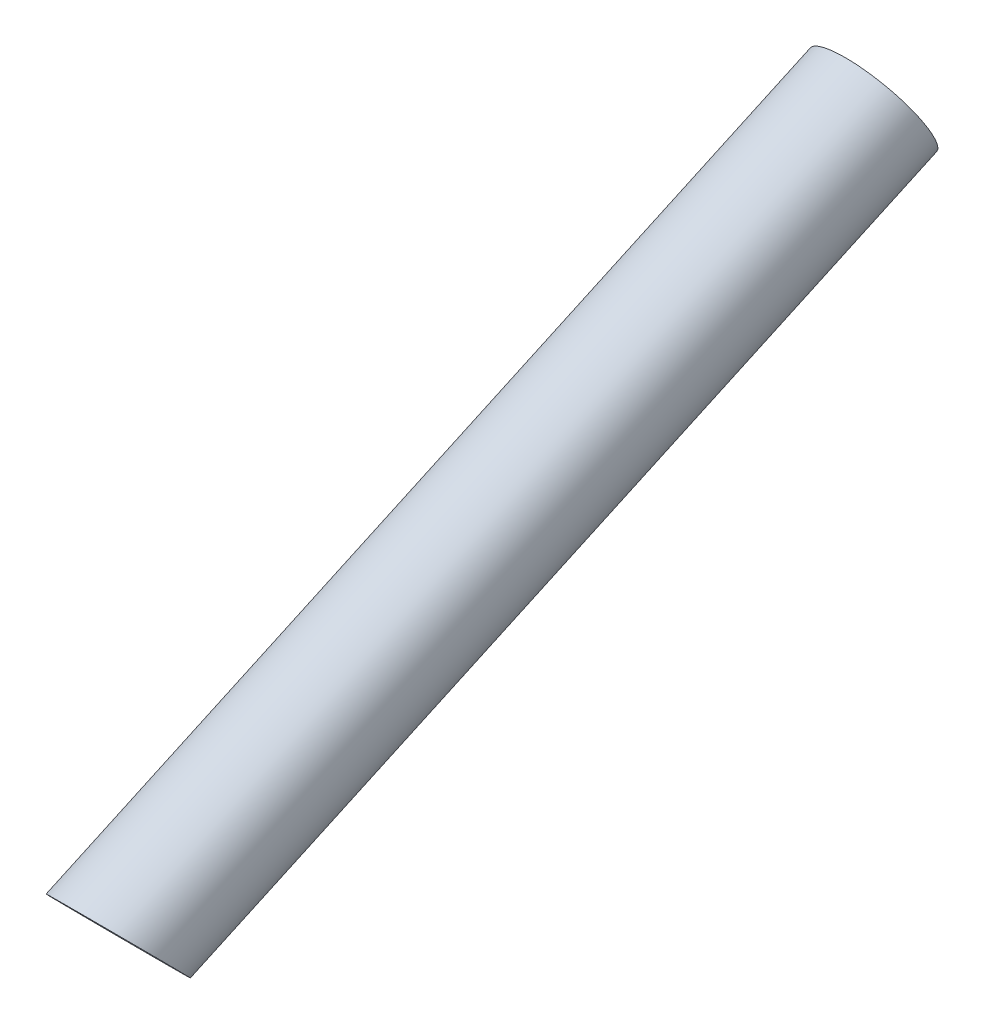
ISO-10303-21;
HEADER;
FILE_DESCRIPTION(('STEP AP214'),'2;1');
FILE_NAME('part.step','',(''),(''),'','','');
FILE_SCHEMA(('AUTOMOTIVE_DESIGN { 1 0 10303 214 1 1 1 1 }'));
ENDSEC;
DATA;
#1=APPLICATION_CONTEXT('core data for automotive mechanical design processes');
#2=APPLICATION_PROTOCOL_DEFINITION('international standard','automotive_design',2000,#1);
#3=PRODUCT_CONTEXT('',#1,'mechanical');
#4=PRODUCT('Part','Part','',(#3));
#5=PRODUCT_RELATED_PRODUCT_CATEGORY('part','',(#4));
#6=PRODUCT_DEFINITION_FORMATION('','',#4);
#7=PRODUCT_DEFINITION_CONTEXT('part definition',#1,'design');
#8=PRODUCT_DEFINITION('design','',#6,#7);
#9=PRODUCT_DEFINITION_SHAPE('','',#8);
#10=(LENGTH_UNIT() NAMED_UNIT(*) SI_UNIT(.MILLI.,.METRE.));
#11=(NAMED_UNIT(*) PLANE_ANGLE_UNIT() SI_UNIT($,.RADIAN.));
#12=(NAMED_UNIT(*) SI_UNIT($,.STERADIAN.) SOLID_ANGLE_UNIT());
#13=UNCERTAINTY_MEASURE_WITH_UNIT(LENGTH_MEASURE(1.E-05),#10,'distance_accuracy_value','');
#14=(GEOMETRIC_REPRESENTATION_CONTEXT(3) GLOBAL_UNCERTAINTY_ASSIGNED_CONTEXT((#13)) GLOBAL_UNIT_ASSIGNED_CONTEXT((#10,
#11,#12)) REPRESENTATION_CONTEXT('',''));
#15=CARTESIAN_POINT('',(0.,0.,0.));
#16=DIRECTION('',(0.,0.,1.));
#17=DIRECTION('',(1.,0.,0.));
#18=AXIS2_PLACEMENT_3D('',#15,#16,#17);
#19=CARTESIAN_POINT('',(0.,140.,1502.61697452191));
#20=DIRECTION('',(0.,0.417026346971061,-0.908894397568811));
#21=DIRECTION('',(0.,0.908894397568811,0.417026346971061));
#22=AXIS2_PLACEMENT_3D('',#19,#20,#21);
#23=CYLINDRICAL_SURFACE('',#22,9.);
#24=CARTESIAN_POINT('',(0.,140.,1502.61697452191));
#25=DIRECTION('',(0.,-0.702736773046392,0.711449947507443));
#26=DIRECTION('',(0.,-0.711449947507443,-0.702736773046392));
#27=AXIS2_PLACEMENT_3D('',#24,#25,#26);
#28=ELLIPSE('',#27,9.57759995228322,9.);
#29=CARTESIAN_POINT('',(0.,133.186017016701,1495.88644283791));
#30=VERTEX_POINT('',#29);
#31=EDGE_CURVE('E53',#30,#30,#28,.T.);
#32=ORIENTED_EDGE('',*,*,#31,.T.);
#33=EDGE_LOOP('',(#32));
#34=FACE_BOUND('',#33,.T.);
#35=CARTESIAN_POINT('',(0.,200.,1371.84906441211));
#36=DIRECTION('',(0.,0.488441827034809,-0.872596459769863));
#37=DIRECTION('',(0.,-0.872596459769863,-0.488441827034809));
#38=AXIS2_PLACEMENT_3D('',#35,#36,#37);
#39=ELLIPSE('',#38,9.02897266897473,9.);
#40=CARTESIAN_POINT('',(0.,192.121350413694,1367.43893650543));
#41=VERTEX_POINT('',#40);
#42=EDGE_CURVE('E43',#41,#41,#39,.T.);
#43=ORIENTED_EDGE('',*,*,#42,.T.);
#44=EDGE_LOOP('',(#43));
#45=FACE_BOUND('',#44,.T.);
#46=ADVANCED_FACE('F39',(#34,#45),#23,.F.);
#47=CARTESIAN_POINT('',(0.,140.,1502.61697452191));
#48=DIRECTION('',(0.,0.417026346971061,-0.908894397568811));
#49=DIRECTION('',(0.,0.908894397568811,0.417026346971061));
#50=AXIS2_PLACEMENT_3D('',#47,#48,#49);
#51=CYLINDRICAL_SURFACE('',#50,10.);
#52=CARTESIAN_POINT('',(0.,140.,1502.61697452191));
#53=DIRECTION('',(0.,-0.702736773046392,0.711449947507443));
#54=DIRECTION('',(0.,-0.711449947507443,-0.702736773046392));
#55=AXIS2_PLACEMENT_3D('',#52,#53,#54);
#56=ELLIPSE('',#55,10.6417777247592,10.);
#57=CARTESIAN_POINT('',(0.,132.428907796334,1495.13860598414));
#58=VERTEX_POINT('',#57);
#59=EDGE_CURVE('E47',#58,#58,#56,.T.);
#60=ORIENTED_EDGE('',*,*,#59,.F.);
#61=EDGE_LOOP('',(#60));
#62=FACE_BOUND('',#61,.T.);
#63=CARTESIAN_POINT('',(0.,200.,1371.84906441211));
#64=DIRECTION('',(0.,0.488441827034809,-0.872596459769863));
#65=DIRECTION('',(0.,-0.872596459769863,-0.488441827034809));
#66=AXIS2_PLACEMENT_3D('',#63,#64,#65);
#67=ELLIPSE('',#66,10.0321918544164,10.);
#68=CARTESIAN_POINT('',(0.,191.245944904104,1366.94892229358));
#69=VERTEX_POINT('',#68);
#70=EDGE_CURVE('E10',#69,#69,#67,.T.);
#71=ORIENTED_EDGE('',*,*,#70,.F.);
#72=EDGE_LOOP('',(#71));
#73=FACE_BOUND('',#72,.T.);
#74=ADVANCED_FACE('F67',(#62,#73),#51,.T.);
#75=CARTESIAN_POINT('',(0.,140.,1502.61697452191));
#76=DIRECTION('',(0.,-0.702736773046392,0.711449947507443));
#77=DIRECTION('',(0.,-0.711449947507443,-0.702736773046392));
#78=AXIS2_PLACEMENT_3D('',#75,#76,#77);
#79=PLANE('',#78);
#80=ORIENTED_EDGE('',*,*,#31,.F.);
#81=EDGE_LOOP('',(#80));
#82=FACE_BOUND('',#81,.T.);
#83=ORIENTED_EDGE('',*,*,#59,.T.);
#84=EDGE_LOOP('',(#83));
#85=FACE_BOUND('',#84,.T.);
#86=ADVANCED_FACE('F62',(#82,#85),#79,.T.);
#87=CARTESIAN_POINT('',(0.,200.,1371.84906441211));
#88=DIRECTION('',(0.,0.488441827034809,-0.872596459769863));
#89=DIRECTION('',(0.,0.872596459769863,0.488441827034809));
#90=AXIS2_PLACEMENT_3D('',#87,#88,#89);
#91=PLANE('',#90);
#92=ORIENTED_EDGE('',*,*,#42,.F.);
#93=EDGE_LOOP('',(#92));
#94=FACE_BOUND('',#93,.T.);
#95=ORIENTED_EDGE('',*,*,#70,.T.);
#96=EDGE_LOOP('',(#95));
#97=FACE_BOUND('',#96,.T.);
#98=ADVANCED_FACE('F41',(#94,#97),#91,.T.);
#99=CLOSED_SHELL('',(#46,#74,#86,#98));
#100=MANIFOLD_SOLID_BREP('B2',#99);
#101=ADVANCED_BREP_SHAPE_REPRESENTATION('',(#18,#100),#14);
#102=SHAPE_DEFINITION_REPRESENTATION(#9,#101);
ENDSEC;
END-ISO-10303-21;
